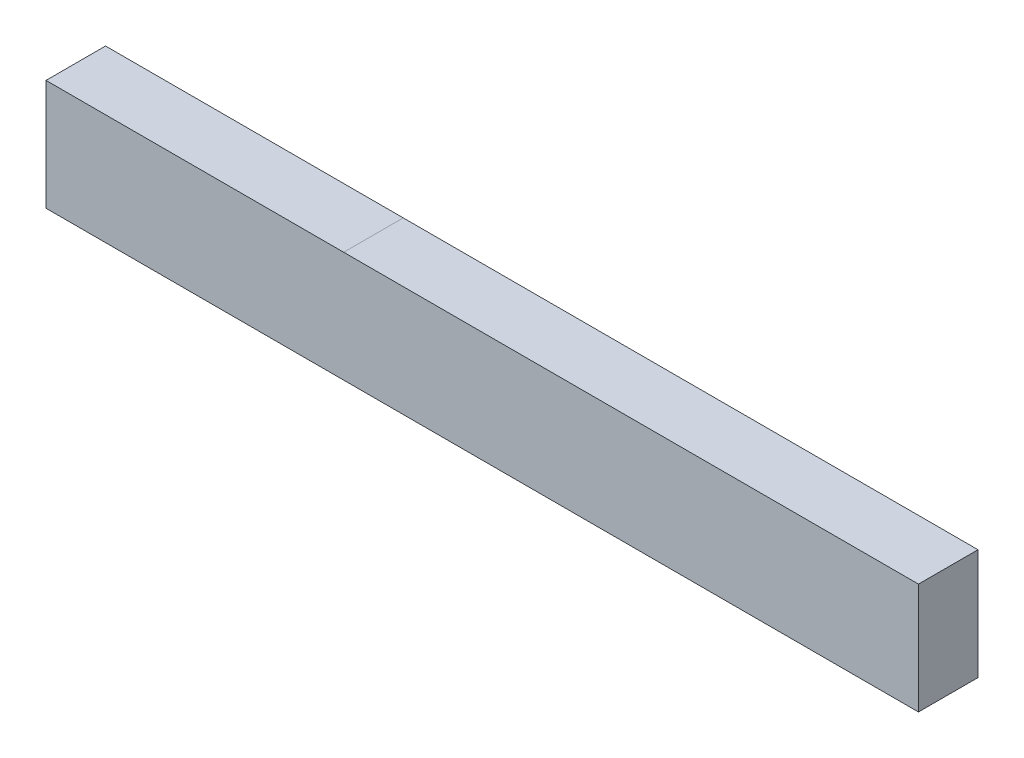
ISO-10303-21;
HEADER;
FILE_DESCRIPTION(('STEP AP214'),'2;1');
FILE_NAME('part.step','',(''),(''),'','','');
FILE_SCHEMA(('AUTOMOTIVE_DESIGN { 1 0 10303 214 1 1 1 1 }'));
ENDSEC;
DATA;
#1=APPLICATION_CONTEXT('core data for automotive mechanical design processes');
#2=APPLICATION_PROTOCOL_DEFINITION('international standard','automotive_design',2000,#1);
#3=PRODUCT_CONTEXT('',#1,'mechanical');
#4=PRODUCT('Part','Part','',(#3));
#5=PRODUCT_RELATED_PRODUCT_CATEGORY('part','',(#4));
#6=PRODUCT_DEFINITION_FORMATION('','',#4);
#7=PRODUCT_DEFINITION_CONTEXT('part definition',#1,'design');
#8=PRODUCT_DEFINITION('design','',#6,#7);
#9=PRODUCT_DEFINITION_SHAPE('','',#8);
#10=(LENGTH_UNIT() NAMED_UNIT(*) SI_UNIT(.MILLI.,.METRE.));
#11=(NAMED_UNIT(*) PLANE_ANGLE_UNIT() SI_UNIT($,.RADIAN.));
#12=(NAMED_UNIT(*) SI_UNIT($,.STERADIAN.) SOLID_ANGLE_UNIT());
#13=UNCERTAINTY_MEASURE_WITH_UNIT(LENGTH_MEASURE(1.E-05),#10,'distance_accuracy_value','');
#14=(GEOMETRIC_REPRESENTATION_CONTEXT(3) GLOBAL_UNCERTAINTY_ASSIGNED_CONTEXT((#13)) GLOBAL_UNIT_ASSIGNED_CONTEXT((#10,
#11,#12)) REPRESENTATION_CONTEXT('',''));
#15=CARTESIAN_POINT('',(0.,0.,0.));
#16=DIRECTION('',(0.,0.,1.));
#17=DIRECTION('',(1.,0.,0.));
#18=AXIS2_PLACEMENT_3D('',#15,#16,#17);
#19=CARTESIAN_POINT('',(0.,0.,10.));
#20=DIRECTION('',(0.,-1.,0.));
#21=DIRECTION('',(0.,0.,-1.));
#22=AXIS2_PLACEMENT_3D('',#19,#20,#21);
#23=PLANE('',#22);
#24=DIRECTION('',(0.,0.,-1.));
#25=VECTOR('',#24,1.);
#26=CARTESIAN_POINT('',(50.,0.,10.));
#27=LINE('',#26,#25);
#28=CARTESIAN_POINT('',(50.,0.,10.));
#29=VERTEX_POINT('',#28);
#30=CARTESIAN_POINT('',(50.,0.,0.));
#31=VERTEX_POINT('',#30);
#32=EDGE_CURVE('E12',#29,#31,#27,.T.);
#33=ORIENTED_EDGE('',*,*,#32,.F.);
#34=DIRECTION('',(-1.,0.,0.));
#35=VECTOR('',#34,1.);
#36=CARTESIAN_POINT('',(0.,0.,10.));
#37=LINE('',#36,#35);
#38=CARTESIAN_POINT('',(146.534881084217,0.,10.));
#39=VERTEX_POINT('',#38);
#40=EDGE_CURVE('E122',#39,#29,#37,.T.);
#41=ORIENTED_EDGE('',*,*,#40,.F.);
#42=DIRECTION('',(0.,0.,-1.));
#43=VECTOR('',#42,1.);
#44=CARTESIAN_POINT('',(146.534881084217,0.,10.));
#45=LINE('',#44,#43);
#46=CARTESIAN_POINT('',(146.534881084217,0.,0.));
#47=VERTEX_POINT('',#46);
#48=EDGE_CURVE('E114',#39,#47,#45,.T.);
#49=ORIENTED_EDGE('',*,*,#48,.T.);
#50=DIRECTION('',(-1.,0.,0.));
#51=VECTOR('',#50,1.);
#52=CARTESIAN_POINT('',(0.,0.,0.));
#53=LINE('',#52,#51);
#54=EDGE_CURVE('E110',#47,#31,#53,.T.);
#55=ORIENTED_EDGE('',*,*,#54,.T.);
#56=EDGE_LOOP('',(#33,#41,#49,#55));
#57=FACE_BOUND('',#56,.T.);
#58=ADVANCED_FACE('F47',(#57),#23,.F.);
#59=CARTESIAN_POINT('',(0.,0.,10.));
#60=DIRECTION('',(1.,0.,0.));
#61=DIRECTION('',(0.,0.,-1.));
#62=AXIS2_PLACEMENT_3D('',#59,#60,#61);
#63=PLANE('',#62);
#64=DIRECTION('',(0.,-1.,0.));
#65=VECTOR('',#64,1.);
#66=CARTESIAN_POINT('',(0.,0.,0.));
#67=LINE('',#66,#65);
#68=CARTESIAN_POINT('',(0.,0.,0.));
#69=VERTEX_POINT('',#68);
#70=CARTESIAN_POINT('',(0.,-18.6036281179138,0.));
#71=VERTEX_POINT('',#70);
#72=EDGE_CURVE('E113',#69,#71,#67,.T.);
#73=ORIENTED_EDGE('',*,*,#72,.T.);
#74=DIRECTION('',(0.,0.,-1.));
#75=VECTOR('',#74,1.);
#76=CARTESIAN_POINT('',(0.,-18.6036281179138,10.));
#77=LINE('',#76,#75);
#78=CARTESIAN_POINT('',(0.,-18.6036281179138,10.));
#79=VERTEX_POINT('',#78);
#80=EDGE_CURVE('E55',#79,#71,#77,.T.);
#81=ORIENTED_EDGE('',*,*,#80,.F.);
#82=DIRECTION('',(0.,-1.,0.));
#83=VECTOR('',#82,1.);
#84=CARTESIAN_POINT('',(0.,0.,10.));
#85=LINE('',#84,#83);
#86=CARTESIAN_POINT('',(0.,0.,10.));
#87=VERTEX_POINT('',#86);
#88=EDGE_CURVE('E101',#87,#79,#85,.T.);
#89=ORIENTED_EDGE('',*,*,#88,.F.);
#90=DIRECTION('',(0.,0.,-1.));
#91=VECTOR('',#90,1.);
#92=CARTESIAN_POINT('',(0.,0.,10.));
#93=LINE('',#92,#91);
#94=EDGE_CURVE('E120',#87,#69,#93,.T.);
#95=ORIENTED_EDGE('',*,*,#94,.T.);
#96=EDGE_LOOP('',(#73,#81,#89,#95));
#97=FACE_BOUND('',#96,.T.);
#98=ADVANCED_FACE('F49',(#97),#63,.F.);
#99=CARTESIAN_POINT('',(0.,-18.6036281179138,10.));
#100=DIRECTION('',(0.,1.,0.));
#101=DIRECTION('',(0.,0.,1.));
#102=AXIS2_PLACEMENT_3D('',#99,#100,#101);
#103=PLANE('',#102);
#104=DIRECTION('',(1.,0.,0.));
#105=VECTOR('',#104,1.);
#106=CARTESIAN_POINT('',(0.,-18.6036281179138,0.));
#107=LINE('',#106,#105);
#108=CARTESIAN_POINT('',(146.534881084217,-18.6036281179138,0.));
#109=VERTEX_POINT('',#108);
#110=EDGE_CURVE('E137',#71,#109,#107,.T.);
#111=ORIENTED_EDGE('',*,*,#110,.T.);
#112=DIRECTION('',(0.,0.,-1.));
#113=VECTOR('',#112,1.);
#114=CARTESIAN_POINT('',(146.534881084217,-18.6036281179138,10.));
#115=LINE('',#114,#113);
#116=CARTESIAN_POINT('',(146.534881084217,-18.6036281179138,10.));
#117=VERTEX_POINT('',#116);
#118=EDGE_CURVE('E97',#117,#109,#115,.T.);
#119=ORIENTED_EDGE('',*,*,#118,.F.);
#120=DIRECTION('',(1.,0.,0.));
#121=VECTOR('',#120,1.);
#122=CARTESIAN_POINT('',(0.,-18.6036281179138,10.));
#123=LINE('',#122,#121);
#124=EDGE_CURVE('E91',#79,#117,#123,.T.);
#125=ORIENTED_EDGE('',*,*,#124,.F.);
#126=ORIENTED_EDGE('',*,*,#80,.T.);
#127=EDGE_LOOP('',(#111,#119,#125,#126));
#128=FACE_BOUND('',#127,.T.);
#129=ADVANCED_FACE('F93',(#128),#103,.F.);
#130=CARTESIAN_POINT('',(146.534881084217,0.,10.));
#131=DIRECTION('',(-1.,0.,0.));
#132=DIRECTION('',(0.,0.,1.));
#133=AXIS2_PLACEMENT_3D('',#130,#131,#132);
#134=PLANE('',#133);
#135=DIRECTION('',(0.,1.,0.));
#136=VECTOR('',#135,1.);
#137=CARTESIAN_POINT('',(146.534881084217,0.,0.));
#138=LINE('',#137,#136);
#139=EDGE_CURVE('E126',#109,#47,#138,.T.);
#140=ORIENTED_EDGE('',*,*,#139,.T.);
#141=ORIENTED_EDGE('',*,*,#48,.F.);
#142=DIRECTION('',(0.,1.,0.));
#143=VECTOR('',#142,1.);
#144=CARTESIAN_POINT('',(146.534881084217,0.,10.));
#145=LINE('',#144,#143);
#146=EDGE_CURVE('E100',#117,#39,#145,.T.);
#147=ORIENTED_EDGE('',*,*,#146,.F.);
#148=ORIENTED_EDGE('',*,*,#118,.T.);
#149=EDGE_LOOP('',(#140,#141,#147,#148));
#150=FACE_BOUND('',#149,.T.);
#151=ADVANCED_FACE('F145',(#150),#134,.F.);
#152=EDGE_CURVE('E106',#29,#87,#37,.T.);
#153=ORIENTED_EDGE('',*,*,#152,.F.);
#154=ORIENTED_EDGE('',*,*,#32,.T.);
#155=EDGE_CURVE('E125',#31,#69,#53,.T.);
#156=ORIENTED_EDGE('',*,*,#155,.T.);
#157=ORIENTED_EDGE('',*,*,#94,.F.);
#158=EDGE_LOOP('',(#153,#154,#156,#157));
#159=FACE_BOUND('',#158,.T.);
#160=ADVANCED_FACE('F141',(#159),#23,.F.);
#161=CARTESIAN_POINT('',(0.,0.,10.));
#162=DIRECTION('',(0.,0.,1.));
#163=DIRECTION('',(1.,0.,0.));
#164=AXIS2_PLACEMENT_3D('',#161,#162,#163);
#165=PLANE('',#164);
#166=ORIENTED_EDGE('',*,*,#88,.T.);
#167=ORIENTED_EDGE('',*,*,#124,.T.);
#168=ORIENTED_EDGE('',*,*,#146,.T.);
#169=ORIENTED_EDGE('',*,*,#40,.T.);
#170=ORIENTED_EDGE('',*,*,#152,.T.);
#171=EDGE_LOOP('',(#166,#167,#168,#169,#170));
#172=FACE_BOUND('',#171,.T.);
#173=ADVANCED_FACE('F104',(#172),#165,.T.);
#174=CARTESIAN_POINT('',(0.,0.,0.));
#175=DIRECTION('',(0.,0.,1.));
#176=DIRECTION('',(1.,0.,0.));
#177=AXIS2_PLACEMENT_3D('',#174,#175,#176);
#178=PLANE('',#177);
#179=ORIENTED_EDGE('',*,*,#72,.F.);
#180=ORIENTED_EDGE('',*,*,#155,.F.);
#181=ORIENTED_EDGE('',*,*,#54,.F.);
#182=ORIENTED_EDGE('',*,*,#139,.F.);
#183=ORIENTED_EDGE('',*,*,#110,.F.);
#184=EDGE_LOOP('',(#179,#180,#181,#182,#183));
#185=FACE_BOUND('',#184,.T.);
#186=ADVANCED_FACE('F144',(#185),#178,.F.);
#187=CLOSED_SHELL('',(#58,#98,#129,#151,#160,#173,#186));
#188=MANIFOLD_SOLID_BREP('B2',#187);
#189=ADVANCED_BREP_SHAPE_REPRESENTATION('',(#18,#188),#14);
#190=SHAPE_DEFINITION_REPRESENTATION(#9,#189);
ENDSEC;
END-ISO-10303-21;
